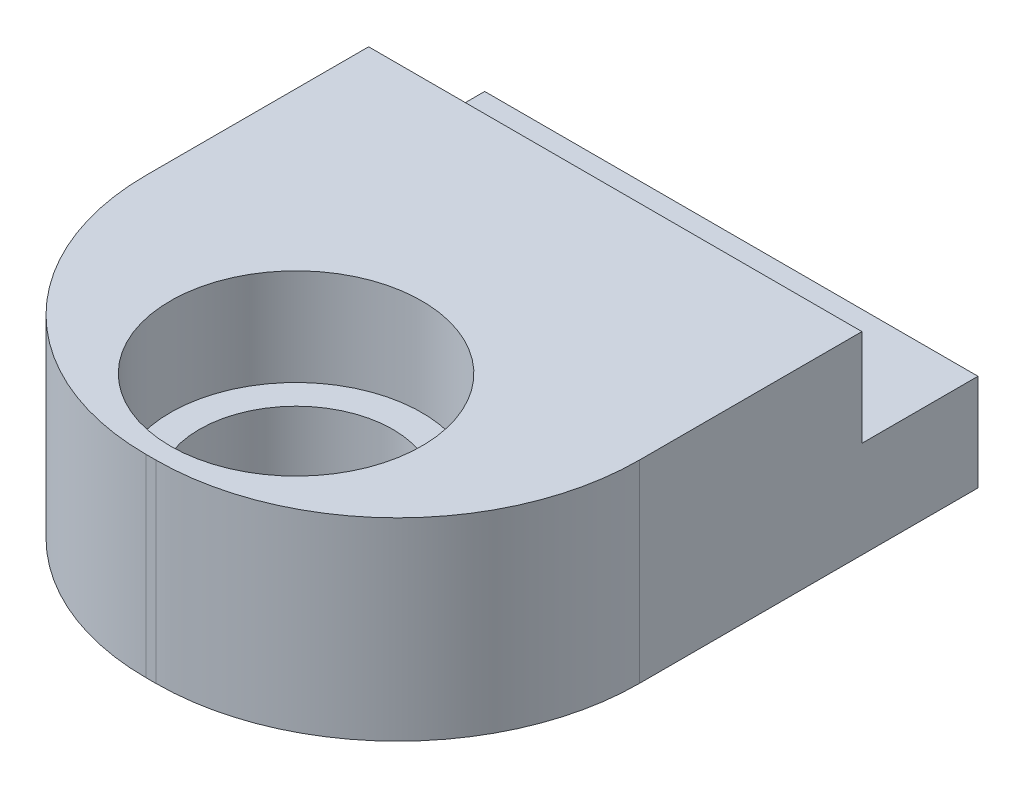
ISO-10303-21;
HEADER;
FILE_DESCRIPTION(('STEP AP214'),'2;1');
FILE_NAME('part.step','',(''),(''),'','','');
FILE_SCHEMA(('AUTOMOTIVE_DESIGN { 1 0 10303 214 1 1 1 1 }'));
ENDSEC;
DATA;
#1=APPLICATION_CONTEXT('core data for automotive mechanical design processes');
#2=APPLICATION_PROTOCOL_DEFINITION('international standard','automotive_design',2000,#1);
#3=PRODUCT_CONTEXT('',#1,'mechanical');
#4=PRODUCT('Part','Part','',(#3));
#5=PRODUCT_RELATED_PRODUCT_CATEGORY('part','',(#4));
#6=PRODUCT_DEFINITION_FORMATION('','',#4);
#7=PRODUCT_DEFINITION_CONTEXT('part definition',#1,'design');
#8=PRODUCT_DEFINITION('design','',#6,#7);
#9=PRODUCT_DEFINITION_SHAPE('','',#8);
#10=(LENGTH_UNIT() NAMED_UNIT(*) SI_UNIT(.MILLI.,.METRE.));
#11=(NAMED_UNIT(*) PLANE_ANGLE_UNIT() SI_UNIT($,.RADIAN.));
#12=(NAMED_UNIT(*) SI_UNIT($,.STERADIAN.) SOLID_ANGLE_UNIT());
#13=UNCERTAINTY_MEASURE_WITH_UNIT(LENGTH_MEASURE(1.E-05),#10,'distance_accuracy_value','');
#14=(GEOMETRIC_REPRESENTATION_CONTEXT(3) GLOBAL_UNCERTAINTY_ASSIGNED_CONTEXT((#13)) GLOBAL_UNIT_ASSIGNED_CONTEXT((#10,
#11,#12)) REPRESENTATION_CONTEXT('',''));
#15=CARTESIAN_POINT('',(0.,0.,0.));
#16=DIRECTION('',(0.,0.,1.));
#17=DIRECTION('',(1.,0.,0.));
#18=AXIS2_PLACEMENT_3D('',#15,#16,#17);
#19=CARTESIAN_POINT('',(0.,10.,0.));
#20=DIRECTION('',(0.,1.,0.));
#21=DIRECTION('',(0.,0.,1.));
#22=AXIS2_PLACEMENT_3D('',#19,#20,#21);
#23=PLANE('',#22);
#24=CARTESIAN_POINT('',(0.,10.,-24.));
#25=DIRECTION('',(0.,1.,0.));
#26=DIRECTION('',(0.,0.,1.));
#27=AXIS2_PLACEMENT_3D('',#24,#25,#26);
#28=CIRCLE('',#27,3.25);
#29=CARTESIAN_POINT('',(0.,10.,-20.75));
#30=VERTEX_POINT('',#29);
#31=EDGE_CURVE('E153',#30,#30,#28,.T.);
#32=ORIENTED_EDGE('',*,*,#31,.F.);
#33=EDGE_LOOP('',(#32));
#34=FACE_BOUND('',#33,.T.);
#35=DIRECTION('',(0.,0.,1.));
#36=VECTOR('',#35,1.);
#37=CARTESIAN_POINT('',(-25.5,10.,30.));
#38=LINE('',#37,#36);
#39=CARTESIAN_POINT('',(-25.5,10.,-30.));
#40=VERTEX_POINT('',#39);
#41=CARTESIAN_POINT('',(-25.5,10.,-18.));
#42=VERTEX_POINT('',#41);
#43=EDGE_CURVE('E161',#40,#42,#38,.T.);
#44=ORIENTED_EDGE('',*,*,#43,.T.);
#45=DIRECTION('',(1.,0.,0.));
#46=VECTOR('',#45,1.);
#47=CARTESIAN_POINT('',(0.,10.,-18.));
#48=LINE('',#47,#46);
#49=CARTESIAN_POINT('',(25.5,10.,-18.));
#50=VERTEX_POINT('',#49);
#51=EDGE_CURVE('E124',#42,#50,#48,.T.);
#52=ORIENTED_EDGE('',*,*,#51,.T.);
#53=DIRECTION('',(0.,0.,-1.));
#54=VECTOR('',#53,1.);
#55=CARTESIAN_POINT('',(25.5,10.,30.));
#56=LINE('',#55,#54);
#57=CARTESIAN_POINT('',(25.5,10.,-30.));
#58=VERTEX_POINT('',#57);
#59=EDGE_CURVE('E164',#50,#58,#56,.T.);
#60=ORIENTED_EDGE('',*,*,#59,.T.);
#61=DIRECTION('',(-1.,0.,0.));
#62=VECTOR('',#61,1.);
#63=CARTESIAN_POINT('',(25.5,10.,-30.));
#64=LINE('',#63,#62);
#65=EDGE_CURVE('E168',#58,#40,#64,.T.);
#66=ORIENTED_EDGE('',*,*,#65,.T.);
#67=EDGE_LOOP('',(#44,#52,#60,#66));
#68=FACE_BOUND('',#67,.T.);
#69=ADVANCED_FACE('F45',(#34,#68),#23,.T.);
#70=CARTESIAN_POINT('',(0.,10.,15.));
#71=DIRECTION('',(0.,1.,0.));
#72=DIRECTION('',(0.,0.,1.));
#73=AXIS2_PLACEMENT_3D('',#70,#71,#72);
#74=CIRCLE('',#73,10.);
#75=CARTESIAN_POINT('',(0.,10.,25.));
#76=VERTEX_POINT('',#75);
#77=EDGE_CURVE('E145',#76,#76,#74,.T.);
#78=ORIENTED_EDGE('',*,*,#77,.F.);
#79=EDGE_LOOP('',(#78));
#80=FACE_BOUND('',#79,.T.);
#81=CARTESIAN_POINT('',(0.,10.,15.));
#82=DIRECTION('',(0.,1.,0.));
#83=DIRECTION('',(0.,0.,1.));
#84=AXIS2_PLACEMENT_3D('',#81,#82,#83);
#85=CIRCLE('',#84,13.);
#86=CARTESIAN_POINT('',(0.,10.,28.));
#87=VERTEX_POINT('',#86);
#88=EDGE_CURVE('E286',#87,#87,#85,.T.);
#89=ORIENTED_EDGE('',*,*,#88,.T.);
#90=EDGE_LOOP('',(#89));
#91=FACE_BOUND('',#90,.T.);
#92=ADVANCED_FACE('F235',(#80,#91),#23,.T.);
#93=CARTESIAN_POINT('',(0.,0.,0.));
#94=DIRECTION('',(0.,1.,0.));
#95=DIRECTION('',(0.,0.,1.));
#96=AXIS2_PLACEMENT_3D('',#93,#94,#95);
#97=PLANE('',#96);
#98=DIRECTION('',(0.,0.,-1.));
#99=VECTOR('',#98,1.);
#100=CARTESIAN_POINT('',(25.5,0.,30.));
#101=LINE('',#100,#99);
#102=CARTESIAN_POINT('',(25.5,0.,5.));
#103=VERTEX_POINT('',#102);
#104=CARTESIAN_POINT('',(25.5,0.,-30.));
#105=VERTEX_POINT('',#104);
#106=EDGE_CURVE('E178',#103,#105,#101,.T.);
#107=ORIENTED_EDGE('',*,*,#106,.F.);
#108=CARTESIAN_POINT('',(0.5,0.,5.));
#109=DIRECTION('',(0.,1.,0.));
#110=DIRECTION('',(0.,0.,1.));
#111=AXIS2_PLACEMENT_3D('',#108,#109,#110);
#112=CIRCLE('',#111,25.);
#113=CARTESIAN_POINT('',(0.500000000000004,0.,30.));
#114=VERTEX_POINT('',#113);
#115=EDGE_CURVE('E197',#103,#114,#112,.F.);
#116=ORIENTED_EDGE('',*,*,#115,.T.);
#117=DIRECTION('',(1.,0.,0.));
#118=VECTOR('',#117,1.);
#119=CARTESIAN_POINT('',(25.5,0.,30.));
#120=LINE('',#119,#118);
#121=CARTESIAN_POINT('',(-0.49999999999999,0.,30.));
#122=VERTEX_POINT('',#121);
#123=EDGE_CURVE('E174',#122,#114,#120,.T.);
#124=ORIENTED_EDGE('',*,*,#123,.F.);
#125=CARTESIAN_POINT('',(-0.499999999999994,0.,5.));
#126=DIRECTION('',(0.,1.,0.));
#127=DIRECTION('',(0.,0.,1.));
#128=AXIS2_PLACEMENT_3D('',#125,#126,#127);
#129=CIRCLE('',#128,25.);
#130=CARTESIAN_POINT('',(-25.5,0.,5.));
#131=VERTEX_POINT('',#130);
#132=EDGE_CURVE('E194',#122,#131,#129,.F.);
#133=ORIENTED_EDGE('',*,*,#132,.T.);
#134=DIRECTION('',(0.,0.,1.));
#135=VECTOR('',#134,1.);
#136=CARTESIAN_POINT('',(-25.5,0.,30.));
#137=LINE('',#136,#135);
#138=CARTESIAN_POINT('',(-25.5,0.,-30.));
#139=VERTEX_POINT('',#138);
#140=EDGE_CURVE('E157',#139,#131,#137,.T.);
#141=ORIENTED_EDGE('',*,*,#140,.F.);
#142=DIRECTION('',(-1.,0.,0.));
#143=VECTOR('',#142,1.);
#144=CARTESIAN_POINT('',(25.5,0.,-30.));
#145=LINE('',#144,#143);
#146=EDGE_CURVE('E165',#105,#139,#145,.T.);
#147=ORIENTED_EDGE('',*,*,#146,.F.);
#148=EDGE_LOOP('',(#107,#116,#124,#133,#141,#147));
#149=FACE_BOUND('',#148,.T.);
#150=CARTESIAN_POINT('',(0.,0.,-24.));
#151=DIRECTION('',(0.,1.,0.));
#152=DIRECTION('',(0.,0.,1.));
#153=AXIS2_PLACEMENT_3D('',#150,#151,#152);
#154=CIRCLE('',#153,3.25);
#155=CARTESIAN_POINT('',(0.,0.,-20.75));
#156=VERTEX_POINT('',#155);
#157=EDGE_CURVE('E149',#156,#156,#154,.T.);
#158=ORIENTED_EDGE('',*,*,#157,.T.);
#159=EDGE_LOOP('',(#158));
#160=FACE_BOUND('',#159,.T.);
#161=CARTESIAN_POINT('',(0.,0.,15.));
#162=DIRECTION('',(0.,1.,0.));
#163=DIRECTION('',(0.,0.,1.));
#164=AXIS2_PLACEMENT_3D('',#161,#162,#163);
#165=CIRCLE('',#164,10.);
#166=CARTESIAN_POINT('',(0.,0.,25.));
#167=VERTEX_POINT('',#166);
#168=EDGE_CURVE('E143',#167,#167,#165,.T.);
#169=ORIENTED_EDGE('',*,*,#168,.T.);
#170=EDGE_LOOP('',(#169));
#171=FACE_BOUND('',#170,.T.);
#172=ADVANCED_FACE('F220',(#149,#160,#171),#97,.F.);
#173=CARTESIAN_POINT('',(-25.5,10.,30.));
#174=DIRECTION('',(1.,0.,0.));
#175=DIRECTION('',(0.,0.,-1.));
#176=AXIS2_PLACEMENT_3D('',#173,#174,#175);
#177=PLANE('',#176);
#178=ORIENTED_EDGE('',*,*,#140,.T.);
#179=DIRECTION('',(0.,-1.,0.));
#180=VECTOR('',#179,1.);
#181=CARTESIAN_POINT('',(-25.5,10.,5.));
#182=LINE('',#181,#180);
#183=CARTESIAN_POINT('',(-25.5,20.,5.));
#184=VERTEX_POINT('',#183);
#185=EDGE_CURVE('E11',#131,#184,#182,.F.);
#186=ORIENTED_EDGE('',*,*,#185,.T.);
#187=DIRECTION('',(0.,0.,-1.));
#188=VECTOR('',#187,1.);
#189=CARTESIAN_POINT('',(-25.5,20.,0.));
#190=LINE('',#189,#188);
#191=CARTESIAN_POINT('',(-25.5,20.,-18.));
#192=VERTEX_POINT('',#191);
#193=EDGE_CURVE('E108',#184,#192,#190,.T.);
#194=ORIENTED_EDGE('',*,*,#193,.T.);
#195=DIRECTION('',(0.,-1.,0.));
#196=VECTOR('',#195,1.);
#197=CARTESIAN_POINT('',(-25.5,20.,-18.));
#198=LINE('',#197,#196);
#199=EDGE_CURVE('E112',#192,#42,#198,.T.);
#200=ORIENTED_EDGE('',*,*,#199,.T.);
#201=ORIENTED_EDGE('',*,*,#43,.F.);
#202=DIRECTION('',(0.,-1.,0.));
#203=VECTOR('',#202,1.);
#204=CARTESIAN_POINT('',(-25.5,10.,-30.));
#205=LINE('',#204,#203);
#206=EDGE_CURVE('E171',#40,#139,#205,.T.);
#207=ORIENTED_EDGE('',*,*,#206,.T.);
#208=EDGE_LOOP('',(#178,#186,#194,#200,#201,#207));
#209=FACE_BOUND('',#208,.T.);
#210=ADVANCED_FACE('F110',(#209),#177,.F.);
#211=CARTESIAN_POINT('',(25.5,10.,30.));
#212=DIRECTION('',(0.,0.,-1.));
#213=DIRECTION('',(-1.,0.,0.));
#214=AXIS2_PLACEMENT_3D('',#211,#212,#213);
#215=PLANE('',#214);
#216=ORIENTED_EDGE('',*,*,#123,.T.);
#217=DIRECTION('',(0.,-1.,0.));
#218=VECTOR('',#217,1.);
#219=CARTESIAN_POINT('',(0.500000000000004,10.,30.));
#220=LINE('',#219,#218);
#221=CARTESIAN_POINT('',(0.500000000000004,20.,30.));
#222=VERTEX_POINT('',#221);
#223=EDGE_CURVE('E204',#114,#222,#220,.F.);
#224=ORIENTED_EDGE('',*,*,#223,.T.);
#225=DIRECTION('',(-1.,0.,0.));
#226=VECTOR('',#225,1.);
#227=CARTESIAN_POINT('',(0.,20.,30.));
#228=LINE('',#227,#226);
#229=CARTESIAN_POINT('',(-0.49999999999999,20.,30.));
#230=VERTEX_POINT('',#229);
#231=EDGE_CURVE('E117',#222,#230,#228,.T.);
#232=ORIENTED_EDGE('',*,*,#231,.T.);
#233=DIRECTION('',(0.,-1.,0.));
#234=VECTOR('',#233,1.);
#235=CARTESIAN_POINT('',(-0.49999999999999,10.,30.));
#236=LINE('',#235,#234);
#237=EDGE_CURVE('E200',#230,#122,#236,.T.);
#238=ORIENTED_EDGE('',*,*,#237,.T.);
#239=EDGE_LOOP('',(#216,#224,#232,#238));
#240=FACE_BOUND('',#239,.T.);
#241=ADVANCED_FACE('F224',(#240),#215,.F.);
#242=CARTESIAN_POINT('',(25.5,10.,30.));
#243=DIRECTION('',(-1.,0.,0.));
#244=DIRECTION('',(0.,0.,1.));
#245=AXIS2_PLACEMENT_3D('',#242,#243,#244);
#246=PLANE('',#245);
#247=DIRECTION('',(0.,0.,1.));
#248=VECTOR('',#247,1.);
#249=CARTESIAN_POINT('',(25.5,20.,0.));
#250=LINE('',#249,#248);
#251=CARTESIAN_POINT('',(25.5,20.,-18.));
#252=VERTEX_POINT('',#251);
#253=CARTESIAN_POINT('',(25.5,20.,5.));
#254=VERTEX_POINT('',#253);
#255=EDGE_CURVE('E128',#252,#254,#250,.T.);
#256=ORIENTED_EDGE('',*,*,#255,.T.);
#257=DIRECTION('',(0.,-1.,0.));
#258=VECTOR('',#257,1.);
#259=CARTESIAN_POINT('',(25.5,10.,5.));
#260=LINE('',#259,#258);
#261=EDGE_CURVE('E190',#254,#103,#260,.T.);
#262=ORIENTED_EDGE('',*,*,#261,.T.);
#263=ORIENTED_EDGE('',*,*,#106,.T.);
#264=DIRECTION('',(0.,-1.,0.));
#265=VECTOR('',#264,1.);
#266=CARTESIAN_POINT('',(25.5,10.,-30.));
#267=LINE('',#266,#265);
#268=EDGE_CURVE('E186',#58,#105,#267,.T.);
#269=ORIENTED_EDGE('',*,*,#268,.F.);
#270=ORIENTED_EDGE('',*,*,#59,.F.);
#271=DIRECTION('',(0.,-1.,0.));
#272=VECTOR('',#271,1.);
#273=CARTESIAN_POINT('',(25.5,20.,-18.));
#274=LINE('',#273,#272);
#275=EDGE_CURVE('E127',#252,#50,#274,.T.);
#276=ORIENTED_EDGE('',*,*,#275,.F.);
#277=EDGE_LOOP('',(#256,#262,#263,#269,#270,#276));
#278=FACE_BOUND('',#277,.T.);
#279=ADVANCED_FACE('F214',(#278),#246,.F.);
#280=CARTESIAN_POINT('',(25.5,10.,-30.));
#281=DIRECTION('',(0.,0.,1.));
#282=DIRECTION('',(1.,0.,0.));
#283=AXIS2_PLACEMENT_3D('',#280,#281,#282);
#284=PLANE('',#283);
#285=ORIENTED_EDGE('',*,*,#146,.T.);
#286=ORIENTED_EDGE('',*,*,#206,.F.);
#287=ORIENTED_EDGE('',*,*,#65,.F.);
#288=ORIENTED_EDGE('',*,*,#268,.T.);
#289=EDGE_LOOP('',(#285,#286,#287,#288));
#290=FACE_BOUND('',#289,.T.);
#291=ADVANCED_FACE('F231',(#290),#284,.F.);
#292=CARTESIAN_POINT('',(0.,10.,-24.));
#293=DIRECTION('',(0.,-1.,0.));
#294=DIRECTION('',(0.,0.,-1.));
#295=AXIS2_PLACEMENT_3D('',#292,#293,#294);
#296=CYLINDRICAL_SURFACE('',#295,3.25);
#297=ORIENTED_EDGE('',*,*,#31,.T.);
#298=EDGE_LOOP('',(#297));
#299=FACE_BOUND('',#298,.T.);
#300=ORIENTED_EDGE('',*,*,#157,.F.);
#301=EDGE_LOOP('',(#300));
#302=FACE_BOUND('',#301,.T.);
#303=ADVANCED_FACE('F246',(#299,#302),#296,.F.);
#304=CARTESIAN_POINT('',(0.,10.,15.));
#305=DIRECTION('',(0.,-1.,0.));
#306=DIRECTION('',(0.,0.,-1.));
#307=AXIS2_PLACEMENT_3D('',#304,#305,#306);
#308=CYLINDRICAL_SURFACE('',#307,10.);
#309=ORIENTED_EDGE('',*,*,#77,.T.);
#310=EDGE_LOOP('',(#309));
#311=FACE_BOUND('',#310,.T.);
#312=ORIENTED_EDGE('',*,*,#168,.F.);
#313=EDGE_LOOP('',(#312));
#314=FACE_BOUND('',#313,.T.);
#315=ADVANCED_FACE('F273',(#311,#314),#308,.F.);
#316=CARTESIAN_POINT('',(0.,20.,0.));
#317=DIRECTION('',(0.,-1.,0.));
#318=DIRECTION('',(0.,0.,-1.));
#319=AXIS2_PLACEMENT_3D('',#316,#317,#318);
#320=PLANE('',#319);
#321=ORIENTED_EDGE('',*,*,#231,.F.);
#322=CARTESIAN_POINT('',(0.5,20.,5.));
#323=DIRECTION('',(0.,-1.,0.));
#324=DIRECTION('',(0.,0.,-1.));
#325=AXIS2_PLACEMENT_3D('',#322,#323,#324);
#326=CIRCLE('',#325,25.);
#327=EDGE_CURVE('E54',#222,#254,#326,.F.);
#328=ORIENTED_EDGE('',*,*,#327,.T.);
#329=ORIENTED_EDGE('',*,*,#255,.F.);
#330=DIRECTION('',(1.,0.,0.));
#331=VECTOR('',#330,1.);
#332=CARTESIAN_POINT('',(0.,20.,-18.));
#333=LINE('',#332,#331);
#334=EDGE_CURVE('E116',#192,#252,#333,.T.);
#335=ORIENTED_EDGE('',*,*,#334,.F.);
#336=ORIENTED_EDGE('',*,*,#193,.F.);
#337=CARTESIAN_POINT('',(-0.499999999999994,20.,5.));
#338=DIRECTION('',(0.,-1.,0.));
#339=DIRECTION('',(0.,0.,-1.));
#340=AXIS2_PLACEMENT_3D('',#337,#338,#339);
#341=CIRCLE('',#340,25.);
#342=EDGE_CURVE('E66',#184,#230,#341,.F.);
#343=ORIENTED_EDGE('',*,*,#342,.T.);
#344=EDGE_LOOP('',(#321,#328,#329,#335,#336,#343));
#345=FACE_BOUND('',#344,.T.);
#346=CARTESIAN_POINT('',(0.,20.,15.));
#347=DIRECTION('',(0.,1.,0.));
#348=DIRECTION('',(0.,0.,1.));
#349=AXIS2_PLACEMENT_3D('',#346,#347,#348);
#350=CIRCLE('',#349,13.);
#351=CARTESIAN_POINT('',(0.,20.,28.));
#352=VERTEX_POINT('',#351);
#353=EDGE_CURVE('E141',#352,#352,#350,.T.);
#354=ORIENTED_EDGE('',*,*,#353,.F.);
#355=EDGE_LOOP('',(#354));
#356=FACE_BOUND('',#355,.T.);
#357=ADVANCED_FACE('F130',(#345,#356),#320,.F.);
#358=CARTESIAN_POINT('',(0.,20.,-18.));
#359=DIRECTION('',(0.,0.,-1.));
#360=DIRECTION('',(-1.,0.,0.));
#361=AXIS2_PLACEMENT_3D('',#358,#359,#360);
#362=PLANE('',#361);
#363=ORIENTED_EDGE('',*,*,#51,.F.);
#364=ORIENTED_EDGE('',*,*,#199,.F.);
#365=ORIENTED_EDGE('',*,*,#334,.T.);
#366=ORIENTED_EDGE('',*,*,#275,.T.);
#367=EDGE_LOOP('',(#363,#364,#365,#366));
#368=FACE_BOUND('',#367,.T.);
#369=ADVANCED_FACE('F121',(#368),#362,.T.);
#370=CARTESIAN_POINT('',(0.,20.,15.));
#371=DIRECTION('',(0.,-1.,0.));
#372=DIRECTION('',(0.,0.,-1.));
#373=AXIS2_PLACEMENT_3D('',#370,#371,#372);
#374=CYLINDRICAL_SURFACE('',#373,13.);
#375=ORIENTED_EDGE('',*,*,#353,.T.);
#376=EDGE_LOOP('',(#375));
#377=FACE_BOUND('',#376,.T.);
#378=ORIENTED_EDGE('',*,*,#88,.F.);
#379=EDGE_LOOP('',(#378));
#380=FACE_BOUND('',#379,.T.);
#381=ADVANCED_FACE('F258',(#377,#380),#374,.F.);
#382=CARTESIAN_POINT('',(0.5,10.,5.));
#383=DIRECTION('',(0.,-1.,0.));
#384=DIRECTION('',(0.,0.,-1.));
#385=AXIS2_PLACEMENT_3D('',#382,#383,#384);
#386=CYLINDRICAL_SURFACE('',#385,25.);
#387=ORIENTED_EDGE('',*,*,#327,.F.);
#388=ORIENTED_EDGE('',*,*,#223,.F.);
#389=ORIENTED_EDGE('',*,*,#115,.F.);
#390=ORIENTED_EDGE('',*,*,#261,.F.);
#391=EDGE_LOOP('',(#387,#388,#389,#390));
#392=FACE_BOUND('',#391,.T.);
#393=ADVANCED_FACE('F217',(#392),#386,.T.);
#394=CARTESIAN_POINT('',(-0.499999999999994,10.,5.));
#395=DIRECTION('',(0.,-1.,0.));
#396=DIRECTION('',(0.,0.,-1.));
#397=AXIS2_PLACEMENT_3D('',#394,#395,#396);
#398=CYLINDRICAL_SURFACE('',#397,25.);
#399=ORIENTED_EDGE('',*,*,#342,.F.);
#400=ORIENTED_EDGE('',*,*,#185,.F.);
#401=ORIENTED_EDGE('',*,*,#132,.F.);
#402=ORIENTED_EDGE('',*,*,#237,.F.);
#403=EDGE_LOOP('',(#399,#400,#401,#402));
#404=FACE_BOUND('',#403,.T.);
#405=ADVANCED_FACE('F47',(#404),#398,.T.);
#406=CLOSED_SHELL('',(#69,#92,#172,#210,#241,#279,#291,#303,#315,#357,#369,#381,#393,#405));
#407=MANIFOLD_SOLID_BREP('B2',#406);
#408=ADVANCED_BREP_SHAPE_REPRESENTATION('',(#18,#407),#14);
#409=SHAPE_DEFINITION_REPRESENTATION(#9,#408);
ENDSEC;
END-ISO-10303-21;
